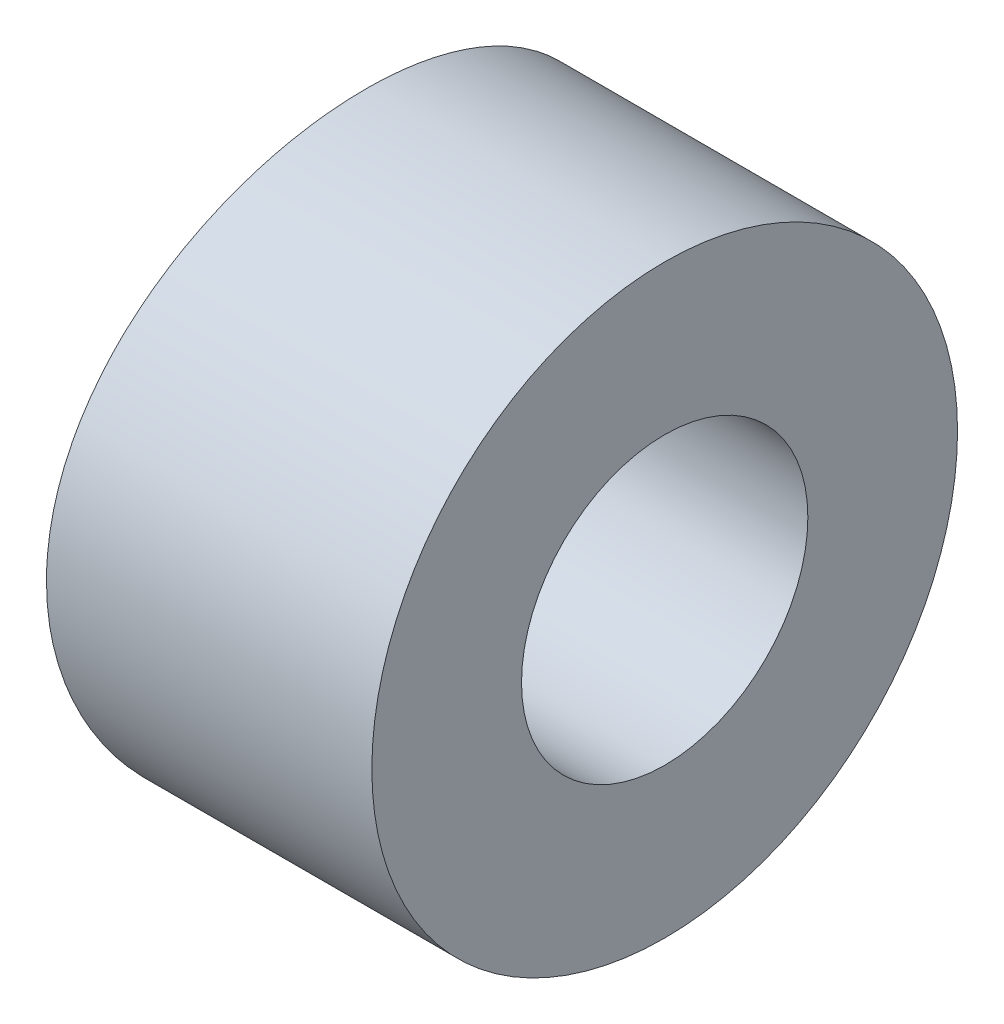
ISO-10303-21;
HEADER;
FILE_DESCRIPTION(('STEP AP214'),'2;1');
FILE_NAME('part.step','',(''),(''),'','','');
FILE_SCHEMA(('AUTOMOTIVE_DESIGN { 1 0 10303 214 1 1 1 1 }'));
ENDSEC;
DATA;
#1=APPLICATION_CONTEXT('core data for automotive mechanical design processes');
#2=APPLICATION_PROTOCOL_DEFINITION('international standard','automotive_design',2000,#1);
#3=PRODUCT_CONTEXT('',#1,'mechanical');
#4=PRODUCT('Part','Part','',(#3));
#5=PRODUCT_RELATED_PRODUCT_CATEGORY('part','',(#4));
#6=PRODUCT_DEFINITION_FORMATION('','',#4);
#7=PRODUCT_DEFINITION_CONTEXT('part definition',#1,'design');
#8=PRODUCT_DEFINITION('design','',#6,#7);
#9=PRODUCT_DEFINITION_SHAPE('','',#8);
#10=(LENGTH_UNIT() NAMED_UNIT(*) SI_UNIT(.MILLI.,.METRE.));
#11=(NAMED_UNIT(*) PLANE_ANGLE_UNIT() SI_UNIT($,.RADIAN.));
#12=(NAMED_UNIT(*) SI_UNIT($,.STERADIAN.) SOLID_ANGLE_UNIT());
#13=UNCERTAINTY_MEASURE_WITH_UNIT(LENGTH_MEASURE(1.E-05),#10,'distance_accuracy_value','');
#14=(GEOMETRIC_REPRESENTATION_CONTEXT(3) GLOBAL_UNCERTAINTY_ASSIGNED_CONTEXT((#13)) GLOBAL_UNIT_ASSIGNED_CONTEXT((#10,
#11,#12)) REPRESENTATION_CONTEXT('',''));
#15=CARTESIAN_POINT('',(0.,0.,0.));
#16=DIRECTION('',(0.,0.,1.));
#17=DIRECTION('',(1.,0.,0.));
#18=AXIS2_PLACEMENT_3D('',#15,#16,#17);
#19=CARTESIAN_POINT('',(2.5,0.,0.));
#20=DIRECTION('',(1.,0.,0.));
#21=DIRECTION('',(0.,0.,-1.));
#22=AXIS2_PLACEMENT_3D('',#19,#20,#21);
#23=PLANE('',#22);
#24=CARTESIAN_POINT('',(2.5,0.,0.));
#25=DIRECTION('',(1.,0.,0.));
#26=DIRECTION('',(0.,0.,-1.));
#27=AXIS2_PLACEMENT_3D('',#24,#25,#26);
#28=CIRCLE('',#27,2.25);
#29=CARTESIAN_POINT('',(2.5,0.,-2.25));
#30=VERTEX_POINT('',#29);
#31=EDGE_CURVE('E10',#30,#30,#28,.T.);
#32=ORIENTED_EDGE('',*,*,#31,.T.);
#33=EDGE_LOOP('',(#32));
#34=FACE_BOUND('',#33,.T.);
#35=CARTESIAN_POINT('',(2.5,0.,0.));
#36=DIRECTION('',(1.,0.,0.));
#37=DIRECTION('',(0.,0.,-1.));
#38=AXIS2_PLACEMENT_3D('',#35,#36,#37);
#39=CIRCLE('',#38,1.1);
#40=CARTESIAN_POINT('',(2.5,0.,-1.1));
#41=VERTEX_POINT('',#40);
#42=EDGE_CURVE('E50',#41,#41,#39,.T.);
#43=ORIENTED_EDGE('',*,*,#42,.F.);
#44=EDGE_LOOP('',(#43));
#45=FACE_BOUND('',#44,.T.);
#46=ADVANCED_FACE('F36',(#34,#45),#23,.T.);
#47=CARTESIAN_POINT('',(2.5,0.,0.));
#48=DIRECTION('',(-1.,0.,0.));
#49=DIRECTION('',(0.,0.,1.));
#50=AXIS2_PLACEMENT_3D('',#47,#48,#49);
#51=CYLINDRICAL_SURFACE('',#50,2.25);
#52=ORIENTED_EDGE('',*,*,#31,.F.);
#53=EDGE_LOOP('',(#52));
#54=FACE_BOUND('',#53,.T.);
#55=CARTESIAN_POINT('',(0.,0.,2.25));
#56=CARTESIAN_POINT('',(2.35167794295858E-06,-0.125314778302703,2.24999507074137));
#57=CARTESIAN_POINT('',(0.0019050355116227,-0.250695025236041,2.23949531667197));
#58=CARTESIAN_POINT('',(0.00930201748511167,-0.497929025830589,2.19779688336334));
#59=CARTESIAN_POINT('',(0.0147994976501633,-0.61977955518689,2.16657986534642));
#60=CARTESIAN_POINT('',(0.0287443368010337,-0.85634070513977,2.08442813225804));
#61=CARTESIAN_POINT('',(0.03718909170985,-0.971057523682651,2.03351081916647));
#62=CARTESIAN_POINT('',(0.0560738912947965,-1.19031041570359,1.91344859662893));
#63=CARTESIAN_POINT('',(0.0665137452767107,-1.29484746073754,1.84430542899491));
#64=CARTESIAN_POINT('',(0.0883421620116857,-1.49194630225166,1.68893416767464));
#65=CARTESIAN_POINT('',(0.0997391395287038,-1.58437843082023,1.60254274020476));
#66=CARTESIAN_POINT('',(0.122123115195737,-1.75351564434035,1.41548031192015));
#67=CARTESIAN_POINT('',(0.133110087755305,-1.83021974896628,1.31480842166733));
#68=CARTESIAN_POINT('',(0.153525728402202,-1.96621534071097,1.10119681596589));
#69=CARTESIAN_POINT('',(0.162943336758653,-2.02538535917849,0.988178620258608));
#70=CARTESIAN_POINT('',(0.179065224591764,-2.12385151557756,0.753611653461132));
#71=CARTESIAN_POINT('',(0.185769703246414,-2.16314911244876,0.632063509345908));
#72=CARTESIAN_POINT('',(0.195650498216517,-2.22035613237561,0.385228742300221));
#73=CARTESIAN_POINT('',(0.198862792339028,-2.2384838031709,0.259994164829672));
#74=CARTESIAN_POINT('',(0.201521086006816,-2.25351572185657,0.00822266446869668));
#75=CARTESIAN_POINT('',(0.200967373274942,-2.250421591092,-0.118314158192711));
#76=CARTESIAN_POINT('',(0.196184342909048,-2.22326655843413,-0.367603813704334));
#77=CARTESIAN_POINT('',(0.191996212265475,-2.19944059163207,-0.490383141760252));
#78=CARTESIAN_POINT('',(0.180460966515432,-2.13186895544367,-0.73017312794993));
#79=CARTESIAN_POINT('',(0.173113745672061,-2.08812261930613,-0.847183592849777));
#80=CARTESIAN_POINT('',(0.156016337256414,-1.98172329792814,-1.07280459082345));
#81=CARTESIAN_POINT('',(0.146254073041604,-1.91897492659891,-1.1813691888204));
#82=CARTESIAN_POINT('',(0.125408761265918,-1.77642280334718,-1.38651624827771));
#83=CARTESIAN_POINT('',(0.114325593358875,-1.69661749685873,-1.48309761631972));
#84=CARTESIAN_POINT('',(0.0918894257586908,-1.52091791215116,-1.66292666442496));
#85=CARTESIAN_POINT('',(0.0805348095829799,-1.42481818829075,-1.74597353941427));
#86=CARTESIAN_POINT('',(0.0589814971105586,-1.21994604447433,-1.89479865245478));
#87=CARTESIAN_POINT('',(0.0487828143441557,-1.11117347621173,-1.96057668838446));
#88=CARTESIAN_POINT('',(0.0306944910433426,-0.883794131631333,-2.07304504260394));
#89=CARTESIAN_POINT('',(0.0228080750781891,-0.765173915108505,-2.11970874066118));
#90=CARTESIAN_POINT('',(0.0102884958940827,-0.521606854168745,-2.19238996560312));
#91=CARTESIAN_POINT('',(0.00565500635671512,-0.396660645694387,-2.21840956344181));
#92=CARTESIAN_POINT('',(0.000229761606721998,-0.145791929965857,-2.2487761407079));
#93=CARTESIAN_POINT('',(-0.000612925585082933,-0.0199052724631342,-2.25341046764673));
#94=CARTESIAN_POINT('',(0.00150287728144647,0.230843957667079,-2.24164291036679));
#95=CARTESIAN_POINT('',(0.00446120050131671,0.355706575000866,-2.22524194945393));
#96=CARTESIAN_POINT('',(0.0137984498894088,0.599934985373588,-2.17211521134119));
#97=CARTESIAN_POINT('',(0.020152390315242,0.719334100147545,-2.13553783443319));
#98=CARTESIAN_POINT('',(0.0355437077070293,0.950308504035699,-2.0432530881487));
#99=CARTESIAN_POINT('',(0.0445812636918934,1.06188327058845,-1.98754444252269));
#100=CARTESIAN_POINT('',(0.0644386982017905,1.27531430306281,-1.85790860805322));
#101=CARTESIAN_POINT('',(0.0752760803676352,1.37705784384257,-1.78379856039432));
#102=CARTESIAN_POINT('',(0.0974618458914045,1.56676837740501,-1.61971244729632));
#103=CARTESIAN_POINT('',(0.108810270010934,1.65473426874333,-1.52973511457962));
#104=CARTESIAN_POINT('',(0.130901806044163,1.8154536156624,-1.33519039909943));
#105=CARTESIAN_POINT('',(0.141636160945798,1.88801463969122,-1.23046289464759));
#106=CARTESIAN_POINT('',(0.161146324051963,2.01451164734633,-1.01013715425028));
#107=CARTESIAN_POINT('',(0.169922201740785,2.0684482917792,-0.894539304177806));
#108=CARTESIAN_POINT('',(0.184488742653214,2.15587157637064,-0.65630628535959));
#109=CARTESIAN_POINT('',(0.190293639550628,2.18945586794783,-0.533707859358794));
#110=CARTESIAN_POINT('',(0.198324611732961,2.23553425979991,-0.284498942101895));
#111=CARTESIAN_POINT('',(0.200551021524384,2.24803033134537,-0.157888826975115));
#112=CARTESIAN_POINT('',(0.201168493440336,2.25151499388537,0.0938980631235701));
#113=CARTESIAN_POINT('',(0.199611577044942,2.24279530369096,0.219070767888886));
#114=CARTESIAN_POINT('',(0.192944456389931,2.20473082416466,0.466138209029054));
#115=CARTESIAN_POINT('',(0.187834278644799,2.17538618873638,0.588032969856918));
#116=CARTESIAN_POINT('',(0.174633633672158,2.0970222310162,0.824951927496115));
#117=CARTESIAN_POINT('',(0.166547391671468,2.04803079321029,0.93998559748715));
#118=CARTESIAN_POINT('',(0.148273703323208,1.93179755336027,1.1602444689913));
#119=CARTESIAN_POINT('',(0.138086136836533,1.86455470775825,1.26546910919272));
#120=CARTESIAN_POINT('',(0.116571330138561,1.712707864739,1.46458492888059));
#121=CARTESIAN_POINT('',(0.105231112034102,1.62789160764337,1.55831285398179));
#122=CARTESIAN_POINT('',(0.0827750023343117,1.44374885987753,1.73030765295763));
#123=CARTESIAN_POINT('',(0.0716591639600716,1.34441897166754,1.80857089653945));
#124=CARTESIAN_POINT('',(0.0508123496956086,1.13310692545184,1.94800554098241));
#125=CARTESIAN_POINT('',(0.0410933499240555,1.02102859353594,2.00903301790399));
#126=CARTESIAN_POINT('',(0.0242833094644881,0.788079420793159,2.11129806586562));
#127=CARTESIAN_POINT('',(0.0171897154601985,0.667217260226829,2.15255487627605));
#128=CARTESIAN_POINT('',(0.00796107413400747,0.454948624626834,2.20542740522508));
#129=CARTESIAN_POINT('',(0.00499281711555239,0.364807523847494,2.22211442790734));
#130=CARTESIAN_POINT('',(0.00101144256537285,0.183122582411243,2.24440240276447));
#131=CARTESIAN_POINT('',(-1.71858246603812E-06,0.0915787730931965,2.25000360225237));
#132=CARTESIAN_POINT('',(0.,0.,2.25));
#133=B_SPLINE_CURVE_WITH_KNOTS('',3,(#55,#56,#57,#58,#59,#60,#61,#62,#63,#64,#65,#66,#67,#68,
#69,#70,#71,#72,#73,#74,#75,#76,#77,#78,#79,#80,#81,#82,#83,#84,#85,#86,#87,#88,#89,#90,#91,#92,
#93,#94,#95,#96,#97,#98,#99,#100,#101,#102,#103,#104,#105,#106,#107,#108,#109,#110,#111,#112,
#113,#114,#115,#116,#117,#118,#119,#120,#121,#122,#123,#124,#125,#126,#127,#128,#129,#130,#131,
#132),.UNSPECIFIED.,.T.,.F.,(4,2,2,2,2,2,2,2,2,2,2,2,2,2,2,2,2,2,2,2,2,2,2,2,2,2,2,2,2,2,2,2,2,
2,2,2,2,2,4),(0.,0.375609330218004,0.751551591467566,1.12716252477213,1.50273757462537,
1.88205399835047,2.26139405763561,2.64330368123029,3.02518526274618,3.40309414041616,
3.78097414617968,4.15462694133209,4.52829224387163,4.90386526403786,5.27947252846837,
5.66022575795442,6.04098344373212,6.42226961636027,6.80351753466959,7.1796275282118,
7.55572101365135,7.92908446879298,8.3024728359008,8.67973156106047,9.05702043052252,
9.4387760677757,9.82051815866815,10.2004138266573,10.5802739810452,10.9549406093795,
11.3296044419763,11.7037383897918,12.0778937339138,12.4568634890669,12.8359221009492,
13.218058213311,13.5998216997123,13.8743193247727,14.1488108260115),.UNSPECIFIED.);
#134=CARTESIAN_POINT('',(0.,0.,2.25));
#135=VERTEX_POINT('',#134);
#136=EDGE_CURVE('E54',#135,#135,#133,.T.);
#137=ORIENTED_EDGE('',*,*,#136,.T.);
#138=EDGE_LOOP('',(#137));
#139=FACE_BOUND('',#138,.T.);
#140=ADVANCED_FACE('F38',(#54,#139),#51,.T.);
#141=CARTESIAN_POINT('',(2.5,0.,0.));
#142=DIRECTION('',(-1.,0.,0.));
#143=DIRECTION('',(0.,0.,1.));
#144=AXIS2_PLACEMENT_3D('',#141,#142,#143);
#145=CYLINDRICAL_SURFACE('',#144,1.1);
#146=CARTESIAN_POINT('',(0.153172555550102,0.,1.1));
#147=CARTESIAN_POINT('',(0.153173186666608,-0.0616630204690008,1.09999731022682));
#148=CARTESIAN_POINT('',(0.15362819749634,-0.123367799958458,1.09479756012859));
#149=CARTESIAN_POINT('',(0.155399017018993,-0.245069431247579,1.07413167350186));
#150=CARTESIAN_POINT('',(0.156715796167645,-0.305064277875133,1.05865396245321));
#151=CARTESIAN_POINT('',(0.160059901633322,-0.421565820228099,1.01788370962131));
#152=CARTESIAN_POINT('',(0.162086819961267,-0.478074496950219,0.992596802523804));
#153=CARTESIAN_POINT('',(0.166622312310871,-0.586032128026879,0.932936134234925));
#154=CARTESIAN_POINT('',(0.169130784667334,-0.637482146899281,0.898564290469933));
#155=CARTESIAN_POINT('',(0.174354519633916,-0.734017328869293,0.821606982889175));
#156=CARTESIAN_POINT('',(0.177070274003252,-0.779086583110874,0.779001594567448));
#157=CARTESIAN_POINT('',(0.182398080345392,-0.861444147962285,0.686828859618783));
#158=CARTESIAN_POINT('',(0.185010127744846,-0.898732115734816,0.637261206400896));
#159=CARTESIAN_POINT('',(0.1898409156406,-0.964522020710804,0.532475529744878));
#160=CARTESIAN_POINT('',(0.192059034490281,-0.993010122573916,0.477248788659838));
#161=CARTESIAN_POINT('',(0.195846733328082,-1.04030312522987,0.362773375519235));
#162=CARTESIAN_POINT('',(0.197416325479331,-1.05910820762952,0.303524778917903));
#163=CARTESIAN_POINT('',(0.199726680524718,-1.08645537631984,0.182846408339008));
#164=CARTESIAN_POINT('',(0.200469529038082,-1.09502329186581,0.121422528140349));
#165=CARTESIAN_POINT('',(0.201049770830475,-1.1017327756193,-0.00199564685802816));
#166=CARTESIAN_POINT('',(0.200887182161073,-1.09987455169124,-0.0639899302610992));
#167=CARTESIAN_POINT('',(0.199676587134978,-1.08580559948602,-0.18661394732916));
#168=CARTESIAN_POINT('',(0.198630956328318,-1.07362264637067,-0.247246894423322));
#169=CARTESIAN_POINT('',(0.195774600269373,-1.03929326803257,-0.36560409779572));
#170=CARTESIAN_POINT('',(0.193963867243929,-1.0171467415834,-0.423328324515745));
#171=CARTESIAN_POINT('',(0.189776904107538,-0.963488010869264,-0.534317739675653));
#172=CARTESIAN_POINT('',(0.187399925389941,-0.931963394431852,-0.587576897966314));
#173=CARTESIAN_POINT('',(0.182347518997041,-0.860452364082473,-0.688058531393247));
#174=CARTESIAN_POINT('',(0.179672084775127,-0.820465764539881,-0.735280874063363));
#175=CARTESIAN_POINT('',(0.174312993731149,-0.733009358968626,-0.822510858145903));
#176=CARTESIAN_POINT('',(0.171629338754825,-0.685515413100704,-0.862494301130608));
#177=CARTESIAN_POINT('',(0.166565094001338,-0.584476541505995,-0.933924479453238));
#178=CARTESIAN_POINT('',(0.164184504504124,-0.530931610189847,-0.965371206905617));
#179=CARTESIAN_POINT('',(0.159995535816648,-0.419293428120548,-1.0188345225006));
#180=CARTESIAN_POINT('',(0.158187235483051,-0.361199551935337,-1.04084981121746));
#181=CARTESIAN_POINT('',(0.155349149064313,-0.242120855678791,-1.07480717557539));
#182=CARTESIAN_POINT('',(0.154319345278364,-0.18113610137135,-1.08674948024832));
#183=CARTESIAN_POINT('',(0.153157763504044,-0.0582186553437772,-1.10019115462078));
#184=CARTESIAN_POINT('',(0.153023081986804,0.00371031772783423,-1.10172428913618));
#185=CARTESIAN_POINT('',(0.153659330988385,0.126944372129834,-1.09439259118222));
#186=CARTESIAN_POINT('',(0.154430252371277,0.188249459747828,-1.08552786360889));
#187=CARTESIAN_POINT('',(0.156788197847034,0.308398312200562,-1.05768024561202));
#188=CARTESIAN_POINT('',(0.158373947807593,0.367245765110395,-1.03871315038557));
#189=CARTESIAN_POINT('',(0.162181824980978,0.480923201437461,-0.991215273030138));
#190=CARTESIAN_POINT('',(0.164403963208873,0.535753115295592,-0.962684325361622));
#191=CARTESIAN_POINT('',(0.169241276254661,0.639993452568302,-0.896783349301505));
#192=CARTESIAN_POINT('',(0.171857444270457,0.689389619046538,-0.859390843691004));
#193=CARTESIAN_POINT('',(0.177184703222276,0.781216105056546,-0.77686060527402));
#194=CARTESIAN_POINT('',(0.179895795921102,0.823646295142998,-0.731722728570976));
#195=CARTESIAN_POINT('',(0.185116100376405,0.900451858463873,-0.63483703357545));
#196=CARTESIAN_POINT('',(0.187624749985256,0.934805277486779,-0.583071776747798));
#197=CARTESIAN_POINT('',(0.192149394355652,0.99433141550494,-0.474487498071143));
#198=CARTESIAN_POINT('',(0.194165394378735,1.01950423255117,-0.417668530205017));
#199=CARTESIAN_POINT('',(0.197475013224873,1.05991699124555,-0.300668007469948));
#200=CARTESIAN_POINT('',(0.198769614835479,1.07517045115614,-0.240491150820284));
#201=CARTESIAN_POINT('',(0.200494568891346,1.09535567669801,-0.118418765885678));
#202=CARTESIAN_POINT('',(0.200924939140297,1.10028765495817,-0.0565232730323195));
#203=CARTESIAN_POINT('',(0.200872960344202,1.09968734559626,0.067013134137049));
#204=CARTESIAN_POINT('',(0.200393593435471,1.09418924799173,0.128654218727907));
#205=CARTESIAN_POINT('',(0.198581895311883,1.07295622805568,0.250133961720561));
#206=CARTESIAN_POINT('',(0.197249563017,1.05722129276225,0.309972617840017));
#207=CARTESIAN_POINT('',(0.193881381657085,1.01597009442175,0.42615065451757));
#208=CARTESIAN_POINT('',(0.191845582108079,0.990454519805684,0.482490281038016));
#209=CARTESIAN_POINT('',(0.187298070245719,0.930370188173356,0.590091856243751));
#210=CARTESIAN_POINT('',(0.184786364585409,0.895801557713874,0.641353875897406));
#211=CARTESIAN_POINT('',(0.179559046568034,0.818464009271182,0.737520158945771));
#212=CARTESIAN_POINT('',(0.176842820206852,0.775669746800378,0.782404006758219));
#213=CARTESIAN_POINT('',(0.171517824889491,0.68314252612828,0.864370644585285));
#214=CARTESIAN_POINT('',(0.168909082070411,0.633407892964831,0.901451546033162));
#215=CARTESIAN_POINT('',(0.164088803882411,0.52830767328704,0.966814217809233));
#216=CARTESIAN_POINT('',(0.161878070696335,0.472931059347462,0.995078300091759));
#217=CARTESIAN_POINT('',(0.158113855250022,0.3582362598399,1.04187061973897));
#218=CARTESIAN_POINT('',(0.15655962035633,0.298922678559095,1.06041001177303));
#219=CARTESIAN_POINT('',(0.154682686515399,0.19938472658291,1.08252285305385));
#220=CARTESIAN_POINT('',(0.154119004229608,0.159799873452775,1.08906802664941));
#221=CARTESIAN_POINT('',(0.153363734169692,0.0801492277245533,1.09780746794197));
#222=CARTESIAN_POINT('',(0.153172145299061,0.0400834365440736,1.10000174846045));
#223=CARTESIAN_POINT('',(0.153172555550102,0.,1.1));
#224=B_SPLINE_CURVE_WITH_KNOTS('',3,(#146,#147,#148,#149,#150,#151,#152,#153,#154,#155,#156,
#157,#158,#159,#160,#161,#162,#163,#164,#165,#166,#167,#168,#169,#170,#171,#172,#173,#174,#175,
#176,#177,#178,#179,#180,#181,#182,#183,#184,#185,#186,#187,#188,#189,#190,#191,#192,#193,#194,
#195,#196,#197,#198,#199,#200,#201,#202,#203,#204,#205,#206,#207,#208,#209,#210,#211,#212,#213,
#214,#215,#216,#217,#218,#219,#220,#221,#222,#223),.UNSPECIFIED.,.T.,.F.,(4,2,2,2,2,2,2,2,2,2,2,
2,2,2,2,2,2,2,2,2,2,2,2,2,2,2,2,2,2,2,2,2,2,2,2,2,2,2,4),(0.,0.184842704688648,
0.369893923706457,0.554839000988689,0.739745075709922,0.925104341629299,1.1104717726072,
1.29612917610158,1.48178309743039,1.66696760201437,1.85214841461517,2.03683263699039,
2.2215187357353,2.40645036768967,2.5913860569121,2.77692897840226,2.96247207128181,
3.1480407193286,3.33360514794256,3.51856736189894,3.7035277099301,3.88819971506683,
4.07287491683332,4.25802365515852,4.44317583362254,4.62882561823524,4.81447342000673,
4.99986768473485,5.18525813018923,5.37004191161889,5.55482592702266,5.73959693839996,
5.92436536691724,6.1097124967582,6.29510443516504,6.48086594445888,6.66641390817442,
6.78656943415141,6.90672460604649),.UNSPECIFIED.);
#225=CARTESIAN_POINT('',(0.153172555550102,0.,1.1));
#226=VERTEX_POINT('',#225);
#227=EDGE_CURVE('E41',#226,#226,#224,.T.);
#228=ORIENTED_EDGE('',*,*,#227,.F.);
#229=EDGE_LOOP('',(#228));
#230=FACE_BOUND('',#229,.T.);
#231=ORIENTED_EDGE('',*,*,#42,.T.);
#232=EDGE_LOOP('',(#231));
#233=FACE_BOUND('',#232,.T.);
#234=ADVANCED_FACE('F65',(#230,#233),#145,.F.);
#235=CARTESIAN_POINT('',(-12.4990999675977,-2.25,0.));
#236=DIRECTION('',(0.,1.,0.));
#237=DIRECTION('',(0.,0.,1.));
#238=AXIS2_PLACEMENT_3D('',#235,#236,#237);
#239=CYLINDRICAL_SURFACE('',#238,12.7);
#240=ORIENTED_EDGE('',*,*,#227,.T.);
#241=EDGE_LOOP('',(#240));
#242=FACE_BOUND('',#241,.T.);
#243=ORIENTED_EDGE('',*,*,#136,.F.);
#244=EDGE_LOOP('',(#243));
#245=FACE_BOUND('',#244,.T.);
#246=ADVANCED_FACE('F62',(#242,#245),#239,.F.);
#247=CLOSED_SHELL('',(#46,#140,#234,#246));
#248=MANIFOLD_SOLID_BREP('B2',#247);
#249=ADVANCED_BREP_SHAPE_REPRESENTATION('',(#18,#248),#14);
#250=SHAPE_DEFINITION_REPRESENTATION(#9,#249);
ENDSEC;
END-ISO-10303-21;
